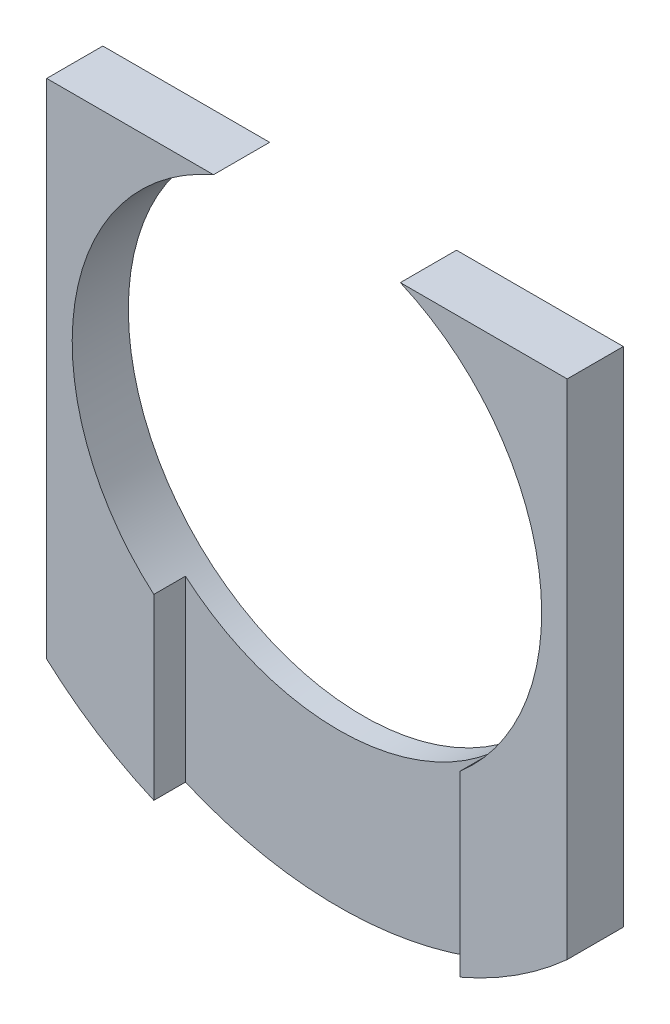
ISO-10303-21;
HEADER;
FILE_DESCRIPTION(('STEP AP214'),'2;1');
FILE_NAME('part.step','',(''),(''),'','','');
FILE_SCHEMA(('AUTOMOTIVE_DESIGN { 1 0 10303 214 1 1 1 1 }'));
ENDSEC;
DATA;
#1=APPLICATION_CONTEXT('core data for automotive mechanical design processes');
#2=APPLICATION_PROTOCOL_DEFINITION('international standard','automotive_design',2000,#1);
#3=PRODUCT_CONTEXT('',#1,'mechanical');
#4=PRODUCT('Part','Part','',(#3));
#5=PRODUCT_RELATED_PRODUCT_CATEGORY('part','',(#4));
#6=PRODUCT_DEFINITION_FORMATION('','',#4);
#7=PRODUCT_DEFINITION_CONTEXT('part definition',#1,'design');
#8=PRODUCT_DEFINITION('design','',#6,#7);
#9=PRODUCT_DEFINITION_SHAPE('','',#8);
#10=(LENGTH_UNIT() NAMED_UNIT(*) SI_UNIT(.MILLI.,.METRE.));
#11=(NAMED_UNIT(*) PLANE_ANGLE_UNIT() SI_UNIT($,.RADIAN.));
#12=(NAMED_UNIT(*) SI_UNIT($,.STERADIAN.) SOLID_ANGLE_UNIT());
#13=UNCERTAINTY_MEASURE_WITH_UNIT(LENGTH_MEASURE(1.E-05),#10,'distance_accuracy_value','');
#14=(GEOMETRIC_REPRESENTATION_CONTEXT(3) GLOBAL_UNCERTAINTY_ASSIGNED_CONTEXT((#13)) GLOBAL_UNIT_ASSIGNED_CONTEXT((#10,
#11,#12)) REPRESENTATION_CONTEXT('',''));
#15=CARTESIAN_POINT('',(0.,0.,0.));
#16=DIRECTION('',(0.,0.,1.));
#17=DIRECTION('',(1.,0.,0.));
#18=AXIS2_PLACEMENT_3D('',#15,#16,#17);
#19=CARTESIAN_POINT('',(0.,0.,32.85));
#20=DIRECTION('',(0.,0.,1.));
#21=DIRECTION('',(1.,0.,0.));
#22=AXIS2_PLACEMENT_3D('',#19,#20,#21);
#23=PLANE('',#22);
#24=CARTESIAN_POINT('',(0.,0.,32.85));
#25=DIRECTION('',(0.,0.,1.));
#26=DIRECTION('',(1.,0.,0.));
#27=AXIS2_PLACEMENT_3D('',#24,#25,#26);
#28=CIRCLE('',#27,19.);
#29=CARTESIAN_POINT('',(-12.75,-14.0867845869808,32.85));
#30=VERTEX_POINT('',#29);
#31=CARTESIAN_POINT('',(-7.5,-17.4570902500961,32.85));
#32=VERTEX_POINT('',#31);
#33=EDGE_CURVE('E166',#30,#32,#28,.T.);
#34=ORIENTED_EDGE('',*,*,#33,.T.);
#35=DIRECTION('',(0.,1.,0.));
#36=VECTOR('',#35,1.);
#37=CARTESIAN_POINT('',(-7.5,0.,32.85));
#38=LINE('',#37,#36);
#39=CARTESIAN_POINT('',(-7.5,-8.71779788708135,32.85));
#40=VERTEX_POINT('',#39);
#41=EDGE_CURVE('E135',#32,#40,#38,.T.);
#42=ORIENTED_EDGE('',*,*,#41,.T.);
#43=CARTESIAN_POINT('',(0.,0.,32.85));
#44=DIRECTION('',(0.,0.,1.));
#45=DIRECTION('',(1.,0.,0.));
#46=AXIS2_PLACEMENT_3D('',#43,#44,#45);
#47=CIRCLE('',#46,11.5);
#48=CARTESIAN_POINT('',(-4.5768438907177,10.55,32.85));
#49=VERTEX_POINT('',#48);
#50=EDGE_CURVE('E134',#40,#49,#47,.F.);
#51=ORIENTED_EDGE('',*,*,#50,.T.);
#52=DIRECTION('',(-1.,0.,0.));
#53=VECTOR('',#52,1.);
#54=CARTESIAN_POINT('',(0.,10.55,32.85));
#55=LINE('',#54,#53);
#56=CARTESIAN_POINT('',(-12.75,10.55,32.85));
#57=VERTEX_POINT('',#56);
#58=EDGE_CURVE('E139',#49,#57,#55,.T.);
#59=ORIENTED_EDGE('',*,*,#58,.T.);
#60=DIRECTION('',(0.,-1.,0.));
#61=VECTOR('',#60,1.);
#62=CARTESIAN_POINT('',(-12.75,0.,32.85));
#63=LINE('',#62,#61);
#64=EDGE_CURVE('E156',#57,#30,#63,.T.);
#65=ORIENTED_EDGE('',*,*,#64,.T.);
#66=EDGE_LOOP('',(#34,#42,#51,#59,#65));
#67=FACE_BOUND('',#66,.T.);
#68=ADVANCED_FACE('F39',(#67),#23,.T.);
#69=CARTESIAN_POINT('',(4.5768438907177,10.55,32.85));
#70=VERTEX_POINT('',#69);
#71=CARTESIAN_POINT('',(7.5,-8.71779788708135,32.85));
#72=VERTEX_POINT('',#71);
#73=EDGE_CURVE('E164',#70,#72,#47,.F.);
#74=ORIENTED_EDGE('',*,*,#73,.T.);
#75=DIRECTION('',(0.,-1.,0.));
#76=VECTOR('',#75,1.);
#77=CARTESIAN_POINT('',(7.5,0.,32.85));
#78=LINE('',#77,#76);
#79=CARTESIAN_POINT('',(7.5,-17.4570902500961,32.85));
#80=VERTEX_POINT('',#79);
#81=EDGE_CURVE('E123',#72,#80,#78,.T.);
#82=ORIENTED_EDGE('',*,*,#81,.T.);
#83=CARTESIAN_POINT('',(12.75,-14.0867845869808,32.85));
#84=VERTEX_POINT('',#83);
#85=EDGE_CURVE('E174',#80,#84,#28,.T.);
#86=ORIENTED_EDGE('',*,*,#85,.T.);
#87=DIRECTION('',(0.,1.,0.));
#88=VECTOR('',#87,1.);
#89=CARTESIAN_POINT('',(12.75,0.,32.85));
#90=LINE('',#89,#88);
#91=CARTESIAN_POINT('',(12.75,10.55,32.85));
#92=VERTEX_POINT('',#91);
#93=EDGE_CURVE('E161',#84,#92,#90,.T.);
#94=ORIENTED_EDGE('',*,*,#93,.T.);
#95=EDGE_CURVE('E61',#92,#70,#55,.T.);
#96=ORIENTED_EDGE('',*,*,#95,.T.);
#97=EDGE_LOOP('',(#74,#82,#86,#94,#96));
#98=FACE_BOUND('',#97,.T.);
#99=ADVANCED_FACE('F194',(#98),#23,.T.);
#100=CARTESIAN_POINT('',(0.,0.,32.95));
#101=DIRECTION('',(0.,0.,-1.));
#102=DIRECTION('',(-1.,0.,0.));
#103=AXIS2_PLACEMENT_3D('',#100,#101,#102);
#104=CYLINDRICAL_SURFACE('',#103,11.5);
#105=ORIENTED_EDGE('',*,*,#50,.F.);
#106=DIRECTION('',(0.,0.,-1.));
#107=VECTOR('',#106,1.);
#108=CARTESIAN_POINT('',(-7.5,-8.71779788708135,32.95));
#109=LINE('',#108,#107);
#110=CARTESIAN_POINT('',(-7.5,-8.71779788708135,31.3));
#111=VERTEX_POINT('',#110);
#112=EDGE_CURVE('E121',#40,#111,#109,.T.);
#113=ORIENTED_EDGE('',*,*,#112,.T.);
#114=CARTESIAN_POINT('',(0.,0.,31.3));
#115=DIRECTION('',(0.,0.,1.));
#116=DIRECTION('',(1.,0.,0.));
#117=AXIS2_PLACEMENT_3D('',#114,#115,#116);
#118=CIRCLE('',#117,11.5);
#119=CARTESIAN_POINT('',(7.5,-8.71779788708135,31.3));
#120=VERTEX_POINT('',#119);
#121=EDGE_CURVE('E111',#111,#120,#118,.T.);
#122=ORIENTED_EDGE('',*,*,#121,.T.);
#123=DIRECTION('',(0.,0.,-1.));
#124=VECTOR('',#123,1.);
#125=CARTESIAN_POINT('',(7.5,-8.71779788708135,32.95));
#126=LINE('',#125,#124);
#127=EDGE_CURVE('E136',#120,#72,#126,.F.);
#128=ORIENTED_EDGE('',*,*,#127,.T.);
#129=ORIENTED_EDGE('',*,*,#73,.F.);
#130=DIRECTION('',(0.,0.,-1.));
#131=VECTOR('',#130,1.);
#132=CARTESIAN_POINT('',(4.5768438907177,10.55,32.95));
#133=LINE('',#132,#131);
#134=CARTESIAN_POINT('',(4.5768438907177,10.55,30.1));
#135=VERTEX_POINT('',#134);
#136=EDGE_CURVE('E147',#70,#135,#133,.T.);
#137=ORIENTED_EDGE('',*,*,#136,.T.);
#138=CARTESIAN_POINT('',(0.,0.,30.1));
#139=DIRECTION('',(0.,0.,1.));
#140=DIRECTION('',(1.,0.,0.));
#141=AXIS2_PLACEMENT_3D('',#138,#139,#140);
#142=CIRCLE('',#141,11.5);
#143=CARTESIAN_POINT('',(-4.5768438907177,10.55,30.1));
#144=VERTEX_POINT('',#143);
#145=EDGE_CURVE('E163',#135,#144,#142,.F.);
#146=ORIENTED_EDGE('',*,*,#145,.T.);
#147=DIRECTION('',(0.,0.,-1.));
#148=VECTOR('',#147,1.);
#149=CARTESIAN_POINT('',(-4.5768438907177,10.55,32.95));
#150=LINE('',#149,#148);
#151=EDGE_CURVE('E148',#144,#49,#150,.F.);
#152=ORIENTED_EDGE('',*,*,#151,.T.);
#153=EDGE_LOOP('',(#105,#113,#122,#128,#129,#137,#146,#152));
#154=FACE_BOUND('',#153,.T.);
#155=ADVANCED_FACE('F131',(#154),#104,.F.);
#156=CARTESIAN_POINT('',(0.,0.,32.85));
#157=DIRECTION('',(0.,0.,-1.));
#158=DIRECTION('',(-1.,0.,0.));
#159=AXIS2_PLACEMENT_3D('',#156,#157,#158);
#160=CYLINDRICAL_SURFACE('',#159,19.);
#161=DIRECTION('',(0.,0.,-1.));
#162=VECTOR('',#161,1.);
#163=CARTESIAN_POINT('',(-7.5,-17.4570902500961,32.85));
#164=LINE('',#163,#162);
#165=CARTESIAN_POINT('',(-7.5,-17.4570902500961,31.3));
#166=VERTEX_POINT('',#165);
#167=EDGE_CURVE('E11',#32,#166,#164,.T.);
#168=ORIENTED_EDGE('',*,*,#167,.F.);
#169=ORIENTED_EDGE('',*,*,#33,.F.);
#170=DIRECTION('',(0.,0.,-1.));
#171=VECTOR('',#170,1.);
#172=CARTESIAN_POINT('',(-12.75,-14.0867845869808,32.85));
#173=LINE('',#172,#171);
#174=CARTESIAN_POINT('',(-12.75,-14.0867845869808,30.1));
#175=VERTEX_POINT('',#174);
#176=EDGE_CURVE('E153',#175,#30,#173,.F.);
#177=ORIENTED_EDGE('',*,*,#176,.F.);
#178=CARTESIAN_POINT('',(0.,0.,30.1));
#179=DIRECTION('',(0.,0.,1.));
#180=DIRECTION('',(1.,0.,0.));
#181=AXIS2_PLACEMENT_3D('',#178,#179,#180);
#182=CIRCLE('',#181,19.);
#183=CARTESIAN_POINT('',(12.75,-14.0867845869808,30.1));
#184=VERTEX_POINT('',#183);
#185=EDGE_CURVE('E169',#175,#184,#182,.T.);
#186=ORIENTED_EDGE('',*,*,#185,.T.);
#187=DIRECTION('',(0.,0.,-1.));
#188=VECTOR('',#187,1.);
#189=CARTESIAN_POINT('',(12.75,-14.0867845869808,32.85));
#190=LINE('',#189,#188);
#191=EDGE_CURVE('E158',#84,#184,#190,.T.);
#192=ORIENTED_EDGE('',*,*,#191,.F.);
#193=ORIENTED_EDGE('',*,*,#85,.F.);
#194=DIRECTION('',(0.,0.,-1.));
#195=VECTOR('',#194,1.);
#196=CARTESIAN_POINT('',(7.5,-17.4570902500961,32.85));
#197=LINE('',#196,#195);
#198=CARTESIAN_POINT('',(7.5,-17.4570902500961,31.3));
#199=VERTEX_POINT('',#198);
#200=EDGE_CURVE('E50',#199,#80,#197,.F.);
#201=ORIENTED_EDGE('',*,*,#200,.F.);
#202=CARTESIAN_POINT('',(0.,0.,31.3));
#203=DIRECTION('',(0.,0.,1.));
#204=DIRECTION('',(1.,0.,0.));
#205=AXIS2_PLACEMENT_3D('',#202,#203,#204);
#206=CIRCLE('',#205,19.);
#207=EDGE_CURVE('E184',#166,#199,#206,.T.);
#208=ORIENTED_EDGE('',*,*,#207,.F.);
#209=EDGE_LOOP('',(#168,#169,#177,#186,#192,#193,#201,#208));
#210=FACE_BOUND('',#209,.T.);
#211=ADVANCED_FACE('F41',(#210),#160,.T.);
#212=CARTESIAN_POINT('',(0.,0.,30.1));
#213=DIRECTION('',(0.,0.,1.));
#214=DIRECTION('',(1.,0.,0.));
#215=AXIS2_PLACEMENT_3D('',#212,#213,#214);
#216=PLANE('',#215);
#217=DIRECTION('',(-1.,0.,0.));
#218=VECTOR('',#217,1.);
#219=CARTESIAN_POINT('',(0.,10.55,30.1));
#220=LINE('',#219,#218);
#221=CARTESIAN_POINT('',(12.75,10.55,30.1));
#222=VERTEX_POINT('',#221);
#223=EDGE_CURVE('E140',#222,#135,#220,.T.);
#224=ORIENTED_EDGE('',*,*,#223,.F.);
#225=DIRECTION('',(0.,1.,0.));
#226=VECTOR('',#225,1.);
#227=CARTESIAN_POINT('',(12.75,0.,30.1));
#228=LINE('',#227,#226);
#229=EDGE_CURVE('E172',#184,#222,#228,.T.);
#230=ORIENTED_EDGE('',*,*,#229,.F.);
#231=ORIENTED_EDGE('',*,*,#185,.F.);
#232=DIRECTION('',(0.,-1.,0.));
#233=VECTOR('',#232,1.);
#234=CARTESIAN_POINT('',(-12.75,0.,30.1));
#235=LINE('',#234,#233);
#236=CARTESIAN_POINT('',(-12.75,10.55,30.1));
#237=VERTEX_POINT('',#236);
#238=EDGE_CURVE('E180',#237,#175,#235,.T.);
#239=ORIENTED_EDGE('',*,*,#238,.F.);
#240=EDGE_CURVE('E133',#144,#237,#220,.T.);
#241=ORIENTED_EDGE('',*,*,#240,.F.);
#242=ORIENTED_EDGE('',*,*,#145,.F.);
#243=EDGE_LOOP('',(#224,#230,#231,#239,#241,#242));
#244=FACE_BOUND('',#243,.T.);
#245=ADVANCED_FACE('F204',(#244),#216,.F.);
#246=CARTESIAN_POINT('',(12.75,20.,32.95));
#247=DIRECTION('',(1.,0.,0.));
#248=DIRECTION('',(0.,0.,-1.));
#249=AXIS2_PLACEMENT_3D('',#246,#247,#248);
#250=PLANE('',#249);
#251=ORIENTED_EDGE('',*,*,#229,.T.);
#252=DIRECTION('',(0.,0.,1.));
#253=VECTOR('',#252,1.);
#254=CARTESIAN_POINT('',(12.75,10.55,32.95));
#255=LINE('',#254,#253);
#256=EDGE_CURVE('E146',#222,#92,#255,.T.);
#257=ORIENTED_EDGE('',*,*,#256,.T.);
#258=ORIENTED_EDGE('',*,*,#93,.F.);
#259=ORIENTED_EDGE('',*,*,#191,.T.);
#260=EDGE_LOOP('',(#251,#257,#258,#259));
#261=FACE_BOUND('',#260,.T.);
#262=ADVANCED_FACE('F203',(#261),#250,.T.);
#263=CARTESIAN_POINT('',(-12.75,-20.,32.95));
#264=DIRECTION('',(-1.,0.,0.));
#265=DIRECTION('',(0.,0.,1.));
#266=AXIS2_PLACEMENT_3D('',#263,#264,#265);
#267=PLANE('',#266);
#268=ORIENTED_EDGE('',*,*,#64,.F.);
#269=DIRECTION('',(0.,0.,-1.));
#270=VECTOR('',#269,1.);
#271=CARTESIAN_POINT('',(-12.75,10.55,32.95));
#272=LINE('',#271,#270);
#273=EDGE_CURVE('E182',#57,#237,#272,.T.);
#274=ORIENTED_EDGE('',*,*,#273,.T.);
#275=ORIENTED_EDGE('',*,*,#238,.T.);
#276=ORIENTED_EDGE('',*,*,#176,.T.);
#277=EDGE_LOOP('',(#268,#274,#275,#276));
#278=FACE_BOUND('',#277,.T.);
#279=ADVANCED_FACE('F218',(#278),#267,.T.);
#280=CARTESIAN_POINT('',(-20.,10.55,32.95));
#281=DIRECTION('',(0.,1.,0.));
#282=DIRECTION('',(0.,0.,1.));
#283=AXIS2_PLACEMENT_3D('',#280,#281,#282);
#284=PLANE('',#283);
#285=ORIENTED_EDGE('',*,*,#240,.T.);
#286=ORIENTED_EDGE('',*,*,#273,.F.);
#287=ORIENTED_EDGE('',*,*,#58,.F.);
#288=ORIENTED_EDGE('',*,*,#151,.F.);
#289=EDGE_LOOP('',(#285,#286,#287,#288));
#290=FACE_BOUND('',#289,.T.);
#291=ADVANCED_FACE('F211',(#290),#284,.T.);
#292=ORIENTED_EDGE('',*,*,#95,.F.);
#293=ORIENTED_EDGE('',*,*,#256,.F.);
#294=ORIENTED_EDGE('',*,*,#223,.T.);
#295=ORIENTED_EDGE('',*,*,#136,.F.);
#296=EDGE_LOOP('',(#292,#293,#294,#295));
#297=FACE_BOUND('',#296,.T.);
#298=ADVANCED_FACE('F207',(#297),#284,.T.);
#299=CARTESIAN_POINT('',(0.,0.,31.3));
#300=DIRECTION('',(0.,0.,1.));
#301=DIRECTION('',(1.,0.,0.));
#302=AXIS2_PLACEMENT_3D('',#299,#300,#301);
#303=PLANE('',#302);
#304=DIRECTION('',(0.,-1.,0.));
#305=VECTOR('',#304,1.);
#306=CARTESIAN_POINT('',(-7.5,-8.1,31.3));
#307=LINE('',#306,#305);
#308=EDGE_CURVE('E53',#111,#166,#307,.T.);
#309=ORIENTED_EDGE('',*,*,#308,.T.);
#310=ORIENTED_EDGE('',*,*,#207,.T.);
#311=DIRECTION('',(0.,1.,0.));
#312=VECTOR('',#311,1.);
#313=CARTESIAN_POINT('',(7.5,-20.,31.3));
#314=LINE('',#313,#312);
#315=EDGE_CURVE('E117',#199,#120,#314,.T.);
#316=ORIENTED_EDGE('',*,*,#315,.T.);
#317=ORIENTED_EDGE('',*,*,#121,.F.);
#318=EDGE_LOOP('',(#309,#310,#316,#317));
#319=FACE_BOUND('',#318,.T.);
#320=ADVANCED_FACE('F113',(#319),#303,.T.);
#321=CARTESIAN_POINT('',(-7.5,-8.1,32.95));
#322=DIRECTION('',(1.,0.,0.));
#323=DIRECTION('',(0.,0.,-1.));
#324=AXIS2_PLACEMENT_3D('',#321,#322,#323);
#325=PLANE('',#324);
#326=ORIENTED_EDGE('',*,*,#41,.F.);
#327=ORIENTED_EDGE('',*,*,#167,.T.);
#328=ORIENTED_EDGE('',*,*,#308,.F.);
#329=ORIENTED_EDGE('',*,*,#112,.F.);
#330=EDGE_LOOP('',(#326,#327,#328,#329));
#331=FACE_BOUND('',#330,.T.);
#332=ADVANCED_FACE('F125',(#331),#325,.T.);
#333=CARTESIAN_POINT('',(7.5,-20.,32.95));
#334=DIRECTION('',(-1.,0.,0.));
#335=DIRECTION('',(0.,0.,1.));
#336=AXIS2_PLACEMENT_3D('',#333,#334,#335);
#337=PLANE('',#336);
#338=ORIENTED_EDGE('',*,*,#315,.F.);
#339=ORIENTED_EDGE('',*,*,#200,.T.);
#340=ORIENTED_EDGE('',*,*,#81,.F.);
#341=ORIENTED_EDGE('',*,*,#127,.F.);
#342=EDGE_LOOP('',(#338,#339,#340,#341));
#343=FACE_BOUND('',#342,.T.);
#344=ADVANCED_FACE('F189',(#343),#337,.T.);
#345=CLOSED_SHELL('',(#68,#99,#155,#211,#245,#262,#279,#291,#298,#320,#332,#344));
#346=MANIFOLD_SOLID_BREP('B2',#345);
#347=ADVANCED_BREP_SHAPE_REPRESENTATION('',(#18,#346),#14);
#348=SHAPE_DEFINITION_REPRESENTATION(#9,#347);
ENDSEC;
END-ISO-10303-21;
